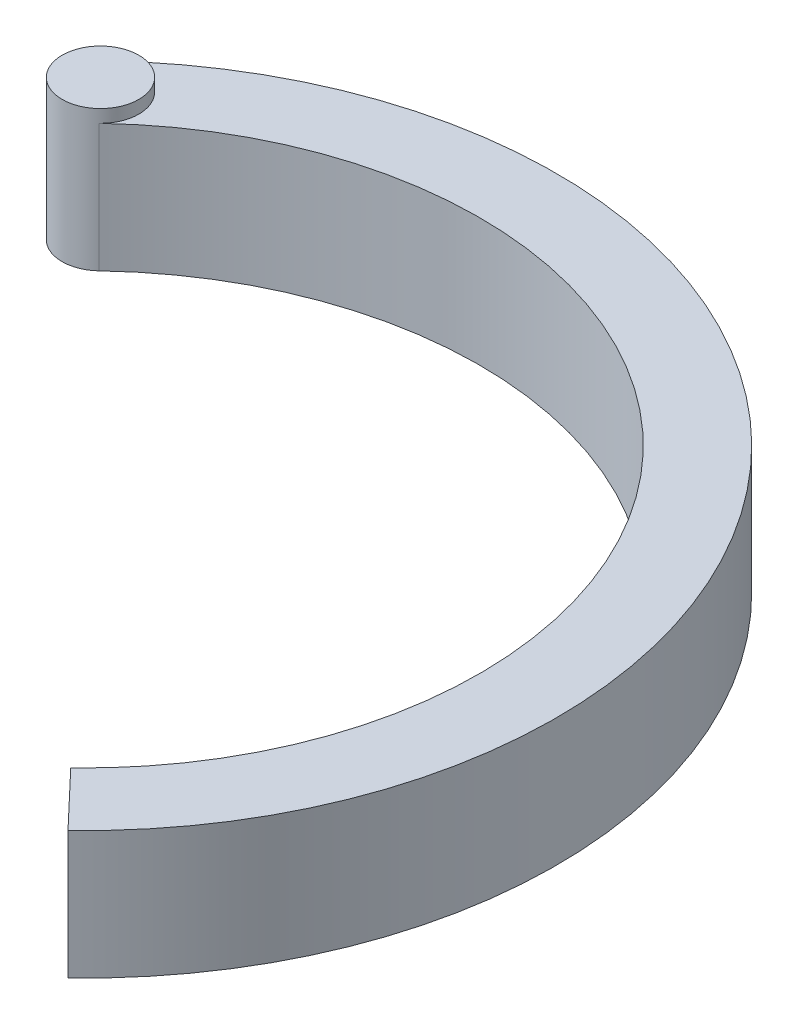
ISO-10303-21;
HEADER;
FILE_DESCRIPTION(('STEP AP214'),'2;1');
FILE_NAME('part.step','',(''),(''),'','','');
FILE_SCHEMA(('AUTOMOTIVE_DESIGN { 1 0 10303 214 1 1 1 1 }'));
ENDSEC;
DATA;
#1=APPLICATION_CONTEXT('core data for automotive mechanical design processes');
#2=APPLICATION_PROTOCOL_DEFINITION('international standard','automotive_design',2000,#1);
#3=PRODUCT_CONTEXT('',#1,'mechanical');
#4=PRODUCT('Part','Part','',(#3));
#5=PRODUCT_RELATED_PRODUCT_CATEGORY('part','',(#4));
#6=PRODUCT_DEFINITION_FORMATION('','',#4);
#7=PRODUCT_DEFINITION_CONTEXT('part definition',#1,'design');
#8=PRODUCT_DEFINITION('design','',#6,#7);
#9=PRODUCT_DEFINITION_SHAPE('','',#8);
#10=(LENGTH_UNIT() NAMED_UNIT(*) SI_UNIT(.MILLI.,.METRE.));
#11=(NAMED_UNIT(*) PLANE_ANGLE_UNIT() SI_UNIT($,.RADIAN.));
#12=(NAMED_UNIT(*) SI_UNIT($,.STERADIAN.) SOLID_ANGLE_UNIT());
#13=UNCERTAINTY_MEASURE_WITH_UNIT(LENGTH_MEASURE(1.E-05),#10,'distance_accuracy_value','');
#14=(GEOMETRIC_REPRESENTATION_CONTEXT(3) GLOBAL_UNCERTAINTY_ASSIGNED_CONTEXT((#13)) GLOBAL_UNIT_ASSIGNED_CONTEXT((#10,
#11,#12)) REPRESENTATION_CONTEXT('',''));
#15=CARTESIAN_POINT('',(0.,0.,0.));
#16=DIRECTION('',(0.,0.,1.));
#17=DIRECTION('',(1.,0.,0.));
#18=AXIS2_PLACEMENT_3D('',#15,#16,#17);
#19=CARTESIAN_POINT('',(35.0313032422177,10.,36.8582459315658));
#20=DIRECTION('',(0.,1.,0.));
#21=DIRECTION('',(0.,0.,1.));
#22=AXIS2_PLACEMENT_3D('',#19,#20,#21);
#23=PLANE('',#22);
#24=CARTESIAN_POINT('',(23.3542021614785,10.,24.5721639543772));
#25=DIRECTION('',(0.,-1.,0.));
#26=DIRECTION('',(0.,0.,1.));
#27=AXIS2_PLACEMENT_3D('',#24,#25,#26);
#28=CIRCLE('',#27,30.9);
#29=CARTESIAN_POINT('',(2.06674355411314,10.,2.17452778357321));
#30=VERTEX_POINT('',#29);
#31=CARTESIAN_POINT('',(44.6416607688438,10.,46.9698001251812));
#32=VERTEX_POINT('',#31);
#33=EDGE_CURVE('E99',#30,#32,#28,.T.);
#34=ORIENTED_EDGE('',*,*,#33,.T.);
#35=DIRECTION('',(0.688914518037715,0.,0.724842594524399));
#36=VECTOR('',#35,1.);
#37=CARTESIAN_POINT('',(35.0313032422177,10.,36.8582459315658));
#38=LINE('',#37,#36);
#39=CARTESIAN_POINT('',(48.7751478770701,10.,51.3188556923276));
#40=VERTEX_POINT('',#39);
#41=EDGE_CURVE('E128',#32,#40,#38,.T.);
#42=ORIENTED_EDGE('',*,*,#41,.T.);
#43=CARTESIAN_POINT('',(23.3542021614785,10.,24.5721639543772));
#44=DIRECTION('',(0.,1.,0.));
#45=DIRECTION('',(0.,0.,1.));
#46=AXIS2_PLACEMENT_3D('',#43,#44,#45);
#47=CIRCLE('',#46,36.9);
#48=CARTESIAN_POINT('',(-2.06674355411313,10.,-2.17452778357322));
#49=VERTEX_POINT('',#48);
#50=EDGE_CURVE('E64',#40,#49,#47,.T.);
#51=ORIENTED_EDGE('',*,*,#50,.T.);
#52=CARTESIAN_POINT('',(0.,10.,0.));
#53=DIRECTION('',(0.,1.,0.));
#54=DIRECTION('',(0.,0.,1.));
#55=AXIS2_PLACEMENT_3D('',#52,#53,#54);
#56=CIRCLE('',#55,3.);
#57=EDGE_CURVE('E131',#30,#49,#56,.T.);
#58=ORIENTED_EDGE('',*,*,#57,.F.);
#59=EDGE_LOOP('',(#34,#42,#51,#58));
#60=FACE_BOUND('',#59,.T.);
#61=ADVANCED_FACE('F47',(#60),#23,.T.);
#62=CARTESIAN_POINT('',(35.0313032422177,0.,36.8582459315658));
#63=DIRECTION('',(0.,1.,0.));
#64=DIRECTION('',(0.,0.,1.));
#65=AXIS2_PLACEMENT_3D('',#62,#63,#64);
#66=PLANE('',#65);
#67=DIRECTION('',(0.688914518037715,0.,0.724842594524399));
#68=VECTOR('',#67,1.);
#69=CARTESIAN_POINT('',(35.0313032422177,0.,36.8582459315658));
#70=LINE('',#69,#68);
#71=CARTESIAN_POINT('',(44.6416607688438,0.,46.9698001251812));
#72=VERTEX_POINT('',#71);
#73=CARTESIAN_POINT('',(48.7751478770701,0.,51.3188556923276));
#74=VERTEX_POINT('',#73);
#75=EDGE_CURVE('E11',#72,#74,#70,.T.);
#76=ORIENTED_EDGE('',*,*,#75,.F.);
#77=CARTESIAN_POINT('',(23.3542021614785,0.,24.5721639543772));
#78=DIRECTION('',(0.,-1.,0.));
#79=DIRECTION('',(0.,0.,1.));
#80=AXIS2_PLACEMENT_3D('',#77,#78,#79);
#81=CIRCLE('',#80,30.9);
#82=CARTESIAN_POINT('',(2.06674355411314,0.,2.17452778357321));
#83=VERTEX_POINT('',#82);
#84=EDGE_CURVE('E90',#83,#72,#81,.T.);
#85=ORIENTED_EDGE('',*,*,#84,.F.);
#86=CARTESIAN_POINT('',(0.,0.,0.));
#87=DIRECTION('',(0.,1.,0.));
#88=DIRECTION('',(0.,0.,1.));
#89=AXIS2_PLACEMENT_3D('',#86,#87,#88);
#90=CIRCLE('',#89,3.);
#91=CARTESIAN_POINT('',(-2.06674355411313,0.,-2.17452778357322));
#92=VERTEX_POINT('',#91);
#93=EDGE_CURVE('E79',#92,#83,#90,.T.);
#94=ORIENTED_EDGE('',*,*,#93,.F.);
#95=CARTESIAN_POINT('',(23.3542021614785,0.,24.5721639543772));
#96=DIRECTION('',(0.,1.,0.));
#97=DIRECTION('',(0.,0.,1.));
#98=AXIS2_PLACEMENT_3D('',#95,#96,#97);
#99=CIRCLE('',#98,36.9);
#100=EDGE_CURVE('E91',#74,#92,#99,.T.);
#101=ORIENTED_EDGE('',*,*,#100,.F.);
#102=EDGE_LOOP('',(#76,#85,#94,#101));
#103=FACE_BOUND('',#102,.T.);
#104=ADVANCED_FACE('F104',(#103),#66,.F.);
#105=CARTESIAN_POINT('',(23.3542021614785,10.,24.5721639543772));
#106=DIRECTION('',(0.,-1.,0.));
#107=DIRECTION('',(0.,0.,-1.));
#108=AXIS2_PLACEMENT_3D('',#105,#106,#107);
#109=CYLINDRICAL_SURFACE('',#108,36.9);
#110=ORIENTED_EDGE('',*,*,#100,.T.);
#111=DIRECTION('',(0.,-1.,0.));
#112=VECTOR('',#111,1.);
#113=CARTESIAN_POINT('',(-2.06674355411313,10.,-2.17452778357322));
#114=LINE('',#113,#112);
#115=EDGE_CURVE('E85',#49,#92,#114,.T.);
#116=ORIENTED_EDGE('',*,*,#115,.F.);
#117=ORIENTED_EDGE('',*,*,#50,.F.);
#118=DIRECTION('',(0.,-1.,0.));
#119=VECTOR('',#118,1.);
#120=CARTESIAN_POINT('',(48.7751478770701,10.,51.3188556923276));
#121=LINE('',#120,#119);
#122=EDGE_CURVE('E57',#40,#74,#121,.T.);
#123=ORIENTED_EDGE('',*,*,#122,.T.);
#124=EDGE_LOOP('',(#110,#116,#117,#123));
#125=FACE_BOUND('',#124,.T.);
#126=ADVANCED_FACE('F49',(#125),#109,.T.);
#127=CARTESIAN_POINT('',(0.,10.,0.));
#128=DIRECTION('',(0.,-1.,0.));
#129=DIRECTION('',(0.,0.,-1.));
#130=AXIS2_PLACEMENT_3D('',#127,#128,#129);
#131=CYLINDRICAL_SURFACE('',#130,3.);
#132=ORIENTED_EDGE('',*,*,#93,.T.);
#133=DIRECTION('',(0.,-1.,0.));
#134=VECTOR('',#133,1.);
#135=CARTESIAN_POINT('',(2.06674355411314,10.,2.17452778357321));
#136=LINE('',#135,#134);
#137=EDGE_CURVE('E84',#30,#83,#136,.T.);
#138=ORIENTED_EDGE('',*,*,#137,.F.);
#139=ORIENTED_EDGE('',*,*,#57,.T.);
#140=ORIENTED_EDGE('',*,*,#115,.T.);
#141=EDGE_LOOP('',(#132,#138,#139,#140));
#142=FACE_BOUND('',#141,.T.);
#143=CARTESIAN_POINT('',(0.,11.,0.));
#144=DIRECTION('',(0.,1.,0.));
#145=DIRECTION('',(0.,0.,1.));
#146=AXIS2_PLACEMENT_3D('',#143,#144,#145);
#147=CIRCLE('',#146,3.);
#148=CARTESIAN_POINT('',(0.,11.,3.));
#149=VERTEX_POINT('',#148);
#150=EDGE_CURVE('E135',#149,#149,#147,.T.);
#151=ORIENTED_EDGE('',*,*,#150,.F.);
#152=EDGE_LOOP('',(#151));
#153=FACE_BOUND('',#152,.T.);
#154=ADVANCED_FACE('F81',(#142,#153),#131,.T.);
#155=CARTESIAN_POINT('',(23.3542021614785,10.,24.5721639543772));
#156=DIRECTION('',(0.,-1.,0.));
#157=DIRECTION('',(0.,0.,-1.));
#158=AXIS2_PLACEMENT_3D('',#155,#156,#157);
#159=CYLINDRICAL_SURFACE('',#158,30.9);
#160=ORIENTED_EDGE('',*,*,#84,.T.);
#161=DIRECTION('',(0.,-1.,0.));
#162=VECTOR('',#161,1.);
#163=CARTESIAN_POINT('',(44.6416607688438,10.,46.9698001251812));
#164=LINE('',#163,#162);
#165=EDGE_CURVE('E101',#32,#72,#164,.T.);
#166=ORIENTED_EDGE('',*,*,#165,.F.);
#167=ORIENTED_EDGE('',*,*,#33,.F.);
#168=ORIENTED_EDGE('',*,*,#137,.T.);
#169=EDGE_LOOP('',(#160,#166,#167,#168));
#170=FACE_BOUND('',#169,.T.);
#171=ADVANCED_FACE('F96',(#170),#159,.F.);
#172=CARTESIAN_POINT('',(0.,11.,0.));
#173=DIRECTION('',(0.,1.,0.));
#174=DIRECTION('',(0.,0.,1.));
#175=AXIS2_PLACEMENT_3D('',#172,#173,#174);
#176=PLANE('',#175);
#177=ORIENTED_EDGE('',*,*,#150,.T.);
#178=EDGE_LOOP('',(#177));
#179=FACE_BOUND('',#178,.T.);
#180=ADVANCED_FACE('F154',(#179),#176,.T.);
#181=CARTESIAN_POINT('',(44.6416607688438,58.,46.9698001251812));
#182=DIRECTION('',(-0.724842594524399,0.,0.688914518037715));
#183=DIRECTION('',(0.688914518037715,0.,0.724842594524399));
#184=AXIS2_PLACEMENT_3D('',#181,#182,#183);
#185=PLANE('',#184);
#186=ORIENTED_EDGE('',*,*,#165,.T.);
#187=ORIENTED_EDGE('',*,*,#75,.T.);
#188=ORIENTED_EDGE('',*,*,#122,.F.);
#189=ORIENTED_EDGE('',*,*,#41,.F.);
#190=EDGE_LOOP('',(#186,#187,#188,#189));
#191=FACE_BOUND('',#190,.T.);
#192=ADVANCED_FACE('F127',(#191),#185,.T.);
#193=CLOSED_SHELL('',(#61,#104,#126,#154,#171,#180,#192));
#194=MANIFOLD_SOLID_BREP('B2',#193);
#195=ADVANCED_BREP_SHAPE_REPRESENTATION('',(#18,#194),#14);
#196=SHAPE_DEFINITION_REPRESENTATION(#9,#195);
ENDSEC;
END-ISO-10303-21;
